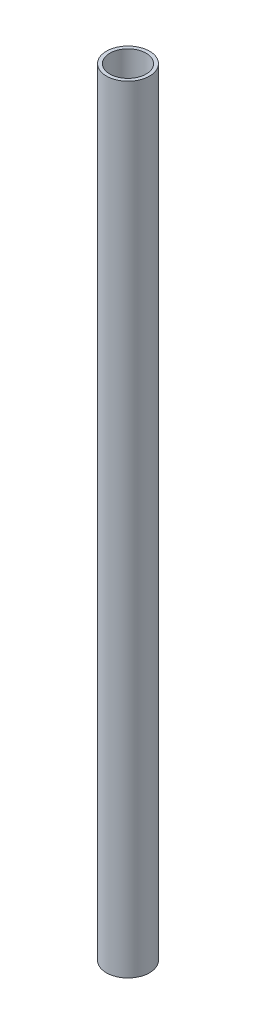
ISO-10303-21;
HEADER;
FILE_DESCRIPTION(('STEP AP214'),'2;1');
FILE_NAME('part.step','',(''),(''),'','','');
FILE_SCHEMA(('AUTOMOTIVE_DESIGN { 1 0 10303 214 1 1 1 1 }'));
ENDSEC;
DATA;
#1=APPLICATION_CONTEXT('core data for automotive mechanical design processes');
#2=APPLICATION_PROTOCOL_DEFINITION('international standard','automotive_design',2000,#1);
#3=PRODUCT_CONTEXT('',#1,'mechanical');
#4=PRODUCT('Part','Part','',(#3));
#5=PRODUCT_RELATED_PRODUCT_CATEGORY('part','',(#4));
#6=PRODUCT_DEFINITION_FORMATION('','',#4);
#7=PRODUCT_DEFINITION_CONTEXT('part definition',#1,'design');
#8=PRODUCT_DEFINITION('design','',#6,#7);
#9=PRODUCT_DEFINITION_SHAPE('','',#8);
#10=(LENGTH_UNIT() NAMED_UNIT(*) SI_UNIT(.MILLI.,.METRE.));
#11=(NAMED_UNIT(*) PLANE_ANGLE_UNIT() SI_UNIT($,.RADIAN.));
#12=(NAMED_UNIT(*) SI_UNIT($,.STERADIAN.) SOLID_ANGLE_UNIT());
#13=UNCERTAINTY_MEASURE_WITH_UNIT(LENGTH_MEASURE(1.E-05),#10,'distance_accuracy_value','');
#14=(GEOMETRIC_REPRESENTATION_CONTEXT(3) GLOBAL_UNCERTAINTY_ASSIGNED_CONTEXT((#13)) GLOBAL_UNIT_ASSIGNED_CONTEXT((#10,
#11,#12)) REPRESENTATION_CONTEXT('',''));
#15=CARTESIAN_POINT('',(0.,0.,0.));
#16=DIRECTION('',(0.,0.,1.));
#17=DIRECTION('',(1.,0.,0.));
#18=AXIS2_PLACEMENT_3D('',#15,#16,#17);
#19=CARTESIAN_POINT('',(0.,450.,0.));
#20=DIRECTION('',(0.,1.,0.));
#21=DIRECTION('',(0.,0.,1.));
#22=AXIS2_PLACEMENT_3D('',#19,#20,#21);
#23=PLANE('',#22);
#24=CARTESIAN_POINT('',(0.,450.,0.));
#25=DIRECTION('',(0.,1.,0.));
#26=DIRECTION('',(0.,0.,1.));
#27=AXIS2_PLACEMENT_3D('',#24,#25,#26);
#28=CIRCLE('',#27,12.5);
#29=CARTESIAN_POINT('',(0.,450.,12.5));
#30=VERTEX_POINT('',#29);
#31=EDGE_CURVE('E10',#30,#30,#28,.T.);
#32=ORIENTED_EDGE('',*,*,#31,.T.);
#33=EDGE_LOOP('',(#32));
#34=FACE_BOUND('',#33,.T.);
#35=CARTESIAN_POINT('',(0.,450.,0.));
#36=DIRECTION('',(0.,1.,0.));
#37=DIRECTION('',(0.,0.,1.));
#38=AXIS2_PLACEMENT_3D('',#35,#36,#37);
#39=CIRCLE('',#38,10.5);
#40=CARTESIAN_POINT('',(0.,450.,10.5));
#41=VERTEX_POINT('',#40);
#42=EDGE_CURVE('E42',#41,#41,#39,.T.);
#43=ORIENTED_EDGE('',*,*,#42,.F.);
#44=EDGE_LOOP('',(#43));
#45=FACE_BOUND('',#44,.T.);
#46=ADVANCED_FACE('F31',(#34,#45),#23,.T.);
#47=CARTESIAN_POINT('',(0.,0.,0.));
#48=DIRECTION('',(0.,1.,0.));
#49=DIRECTION('',(0.,0.,1.));
#50=AXIS2_PLACEMENT_3D('',#47,#48,#49);
#51=PLANE('',#50);
#52=CARTESIAN_POINT('',(0.,0.,0.));
#53=DIRECTION('',(0.,1.,0.));
#54=DIRECTION('',(0.,0.,1.));
#55=AXIS2_PLACEMENT_3D('',#52,#53,#54);
#56=CIRCLE('',#55,12.5);
#57=CARTESIAN_POINT('',(0.,0.,12.5));
#58=VERTEX_POINT('',#57);
#59=EDGE_CURVE('E35',#58,#58,#56,.T.);
#60=ORIENTED_EDGE('',*,*,#59,.F.);
#61=EDGE_LOOP('',(#60));
#62=FACE_BOUND('',#61,.T.);
#63=CARTESIAN_POINT('',(0.,0.,0.));
#64=DIRECTION('',(0.,1.,0.));
#65=DIRECTION('',(0.,0.,1.));
#66=AXIS2_PLACEMENT_3D('',#63,#64,#65);
#67=CIRCLE('',#66,10.5);
#68=CARTESIAN_POINT('',(0.,0.,10.5));
#69=VERTEX_POINT('',#68);
#70=EDGE_CURVE('E44',#69,#69,#67,.T.);
#71=ORIENTED_EDGE('',*,*,#70,.T.);
#72=EDGE_LOOP('',(#71));
#73=FACE_BOUND('',#72,.T.);
#74=ADVANCED_FACE('F54',(#62,#73),#51,.F.);
#75=CARTESIAN_POINT('',(0.,450.,0.));
#76=DIRECTION('',(0.,-1.,0.));
#77=DIRECTION('',(0.,0.,-1.));
#78=AXIS2_PLACEMENT_3D('',#75,#76,#77);
#79=CYLINDRICAL_SURFACE('',#78,12.5);
#80=ORIENTED_EDGE('',*,*,#31,.F.);
#81=EDGE_LOOP('',(#80));
#82=FACE_BOUND('',#81,.T.);
#83=ORIENTED_EDGE('',*,*,#59,.T.);
#84=EDGE_LOOP('',(#83));
#85=FACE_BOUND('',#84,.T.);
#86=ADVANCED_FACE('F33',(#82,#85),#79,.T.);
#87=CARTESIAN_POINT('',(0.,450.,0.));
#88=DIRECTION('',(0.,-1.,0.));
#89=DIRECTION('',(0.,0.,-1.));
#90=AXIS2_PLACEMENT_3D('',#87,#88,#89);
#91=CYLINDRICAL_SURFACE('',#90,10.5);
#92=ORIENTED_EDGE('',*,*,#42,.T.);
#93=EDGE_LOOP('',(#92));
#94=FACE_BOUND('',#93,.T.);
#95=ORIENTED_EDGE('',*,*,#70,.F.);
#96=EDGE_LOOP('',(#95));
#97=FACE_BOUND('',#96,.T.);
#98=ADVANCED_FACE('F50',(#94,#97),#91,.F.);
#99=CLOSED_SHELL('',(#46,#74,#86,#98));
#100=MANIFOLD_SOLID_BREP('B2',#99);
#101=ADVANCED_BREP_SHAPE_REPRESENTATION('',(#18,#100),#14);
#102=SHAPE_DEFINITION_REPRESENTATION(#9,#101);
ENDSEC;
END-ISO-10303-21;
